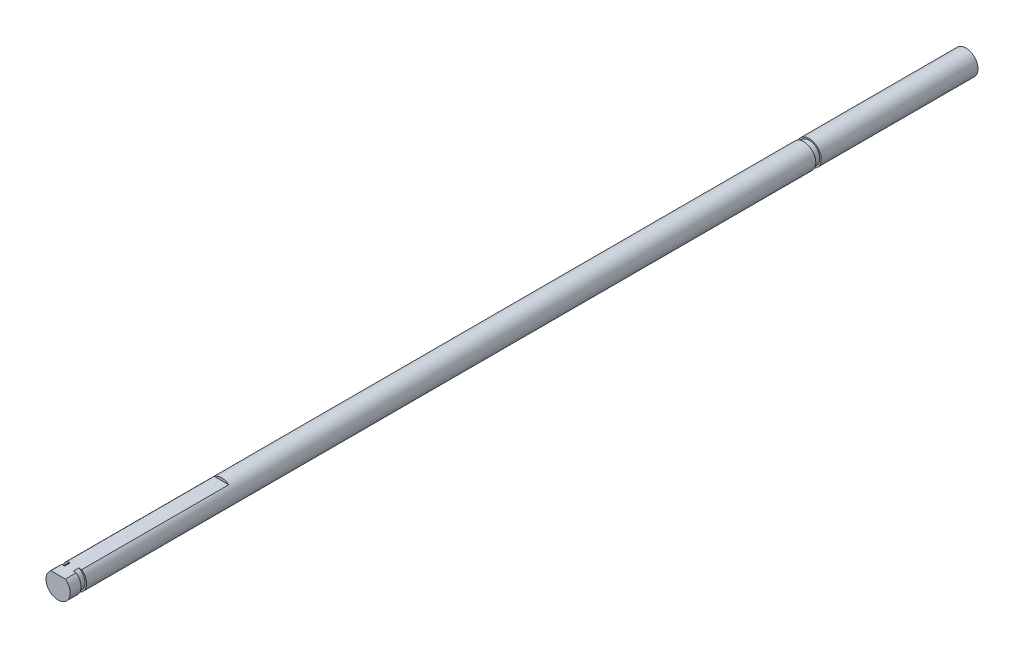
ISO-10303-21;
HEADER;
FILE_DESCRIPTION(('STEP AP214'),'2;1');
FILE_NAME('part.step','',(''),(''),'','','');
FILE_SCHEMA(('AUTOMOTIVE_DESIGN { 1 0 10303 214 1 1 1 1 }'));
ENDSEC;
DATA;
#1=APPLICATION_CONTEXT('core data for automotive mechanical design processes');
#2=APPLICATION_PROTOCOL_DEFINITION('international standard','automotive_design',2000,#1);
#3=PRODUCT_CONTEXT('',#1,'mechanical');
#4=PRODUCT('Part','Part','',(#3));
#5=PRODUCT_RELATED_PRODUCT_CATEGORY('part','',(#4));
#6=PRODUCT_DEFINITION_FORMATION('','',#4);
#7=PRODUCT_DEFINITION_CONTEXT('part definition',#1,'design');
#8=PRODUCT_DEFINITION('design','',#6,#7);
#9=PRODUCT_DEFINITION_SHAPE('','',#8);
#10=(LENGTH_UNIT() NAMED_UNIT(*) SI_UNIT(.MILLI.,.METRE.));
#11=(NAMED_UNIT(*) PLANE_ANGLE_UNIT() SI_UNIT($,.RADIAN.));
#12=(NAMED_UNIT(*) SI_UNIT($,.STERADIAN.) SOLID_ANGLE_UNIT());
#13=UNCERTAINTY_MEASURE_WITH_UNIT(LENGTH_MEASURE(1.E-05),#10,'distance_accuracy_value','');
#14=(GEOMETRIC_REPRESENTATION_CONTEXT(3) GLOBAL_UNCERTAINTY_ASSIGNED_CONTEXT((#13)) GLOBAL_UNIT_ASSIGNED_CONTEXT((#10,
#11,#12)) REPRESENTATION_CONTEXT('',''));
#15=CARTESIAN_POINT('',(0.,0.,0.));
#16=DIRECTION('',(0.,0.,1.));
#17=DIRECTION('',(1.,0.,0.));
#18=AXIS2_PLACEMENT_3D('',#15,#16,#17);
#19=CARTESIAN_POINT('',(0.,0.,75.));
#20=DIRECTION('',(0.,0.,-1.));
#21=DIRECTION('',(-1.,0.,0.));
#22=AXIS2_PLACEMENT_3D('',#19,#20,#21);
#23=CYLINDRICAL_SURFACE('',#22,2.);
#24=CARTESIAN_POINT('',(0.,0.,75.));
#25=DIRECTION('',(0.,0.,1.));
#26=DIRECTION('',(1.,0.,0.));
#27=AXIS2_PLACEMENT_3D('',#24,#25,#26);
#28=CIRCLE('',#27,2.);
#29=CARTESIAN_POINT('',(-1.2,1.6,75.));
#30=VERTEX_POINT('',#29);
#31=CARTESIAN_POINT('',(1.2,1.6,75.));
#32=VERTEX_POINT('',#31);
#33=EDGE_CURVE('E11',#30,#32,#28,.T.);
#34=ORIENTED_EDGE('',*,*,#33,.F.);
#35=DIRECTION('',(0.,0.,1.));
#36=VECTOR('',#35,1.);
#37=CARTESIAN_POINT('',(-1.2,1.6,48.));
#38=LINE('',#37,#36);
#39=CARTESIAN_POINT('',(-1.2,1.6,73.2));
#40=VERTEX_POINT('',#39);
#41=EDGE_CURVE('E102',#40,#30,#38,.T.);
#42=ORIENTED_EDGE('',*,*,#41,.F.);
#43=CARTESIAN_POINT('',(0.,0.,73.2));
#44=DIRECTION('',(0.,0.,-1.));
#45=DIRECTION('',(0.,1.,0.));
#46=AXIS2_PLACEMENT_3D('',#43,#44,#45);
#47=CIRCLE('',#46,2.);
#48=CARTESIAN_POINT('',(1.2,1.6,73.2));
#49=VERTEX_POINT('',#48);
#50=EDGE_CURVE('E133',#49,#40,#47,.T.);
#51=ORIENTED_EDGE('',*,*,#50,.F.);
#52=DIRECTION('',(0.,0.,1.));
#53=VECTOR('',#52,1.);
#54=CARTESIAN_POINT('',(1.2,1.6,48.));
#55=LINE('',#54,#53);
#56=EDGE_CURVE('E108',#49,#32,#55,.T.);
#57=ORIENTED_EDGE('',*,*,#56,.T.);
#58=EDGE_LOOP('',(#34,#42,#51,#57));
#59=FACE_BOUND('',#58,.T.);
#60=ADVANCED_FACE('F40',(#59),#23,.T.);
#61=CARTESIAN_POINT('',(0.,0.,75.));
#62=DIRECTION('',(0.,0.,1.));
#63=DIRECTION('',(1.,0.,0.));
#64=AXIS2_PLACEMENT_3D('',#61,#62,#63);
#65=PLANE('',#64);
#66=DIRECTION('',(1.,0.,0.));
#67=VECTOR('',#66,1.);
#68=CARTESIAN_POINT('',(1.2,1.6,75.));
#69=LINE('',#68,#67);
#70=EDGE_CURVE('E96',#30,#32,#69,.T.);
#71=ORIENTED_EDGE('',*,*,#70,.F.);
#72=ORIENTED_EDGE('',*,*,#33,.T.);
#73=EDGE_LOOP('',(#71,#72));
#74=FACE_BOUND('',#73,.T.);
#75=ADVANCED_FACE('F179',(#74),#65,.T.);
#76=CARTESIAN_POINT('',(0.,2.,73.2));
#77=DIRECTION('',(0.,0.,1.));
#78=DIRECTION('',(0.,-1.,0.));
#79=AXIS2_PLACEMENT_3D('',#76,#77,#78);
#80=PLANE('',#79);
#81=ORIENTED_EDGE('',*,*,#50,.T.);
#82=DIRECTION('',(1.,0.,0.));
#83=VECTOR('',#82,1.);
#84=CARTESIAN_POINT('',(0.,1.6,73.2));
#85=LINE('',#84,#83);
#86=CARTESIAN_POINT('',(-0.708872343937895,1.6,73.2));
#87=VERTEX_POINT('',#86);
#88=EDGE_CURVE('E120',#40,#87,#85,.T.);
#89=ORIENTED_EDGE('',*,*,#88,.T.);
#90=CARTESIAN_POINT('',(0.,0.,73.2));
#91=DIRECTION('',(0.,0.,-1.));
#92=DIRECTION('',(0.,1.,0.));
#93=AXIS2_PLACEMENT_3D('',#90,#91,#92);
#94=CIRCLE('',#93,1.75);
#95=CARTESIAN_POINT('',(0.708872343937895,1.6,73.2));
#96=VERTEX_POINT('',#95);
#97=EDGE_CURVE('E130',#96,#87,#94,.T.);
#98=ORIENTED_EDGE('',*,*,#97,.F.);
#99=EDGE_CURVE('E62',#96,#49,#85,.T.);
#100=ORIENTED_EDGE('',*,*,#99,.T.);
#101=EDGE_LOOP('',(#81,#89,#98,#100));
#102=FACE_BOUND('',#101,.T.);
#103=ADVANCED_FACE('F192',(#102),#80,.F.);
#104=CARTESIAN_POINT('',(0.,0.,-75.));
#105=DIRECTION('',(0.,0.,-1.));
#106=DIRECTION('',(0.,1.,0.));
#107=AXIS2_PLACEMENT_3D('',#104,#105,#106);
#108=CYLINDRICAL_SURFACE('',#107,1.75);
#109=ORIENTED_EDGE('',*,*,#97,.T.);
#110=DIRECTION('',(0.,0.,-1.));
#111=VECTOR('',#110,1.);
#112=CARTESIAN_POINT('',(-0.708872343937895,1.6,-75.));
#113=LINE('',#112,#111);
#114=CARTESIAN_POINT('',(-0.708872343937892,1.6,72.3));
#115=VERTEX_POINT('',#114);
#116=EDGE_CURVE('E116',#87,#115,#113,.T.);
#117=ORIENTED_EDGE('',*,*,#116,.T.);
#118=CARTESIAN_POINT('',(0.,0.,72.3));
#119=DIRECTION('',(0.,0.,-1.));
#120=DIRECTION('',(0.,1.,0.));
#121=AXIS2_PLACEMENT_3D('',#118,#119,#120);
#122=CIRCLE('',#121,1.75);
#123=CARTESIAN_POINT('',(0.708872343937892,1.6,72.3));
#124=VERTEX_POINT('',#123);
#125=EDGE_CURVE('E126',#124,#115,#122,.T.);
#126=ORIENTED_EDGE('',*,*,#125,.F.);
#127=DIRECTION('',(0.,0.,-1.));
#128=VECTOR('',#127,1.);
#129=CARTESIAN_POINT('',(0.708872343937895,1.6,-75.));
#130=LINE('',#129,#128);
#131=EDGE_CURVE('E123',#124,#96,#130,.F.);
#132=ORIENTED_EDGE('',*,*,#131,.T.);
#133=EDGE_LOOP('',(#109,#117,#126,#132));
#134=FACE_BOUND('',#133,.T.);
#135=ADVANCED_FACE('F175',(#134),#108,.T.);
#136=CARTESIAN_POINT('',(0.,1.75,72.3));
#137=DIRECTION('',(0.,0.,-1.));
#138=DIRECTION('',(0.,1.,0.));
#139=AXIS2_PLACEMENT_3D('',#136,#137,#138);
#140=PLANE('',#139);
#141=CARTESIAN_POINT('',(0.,0.,72.3));
#142=DIRECTION('',(0.,0.,-1.));
#143=DIRECTION('',(0.,1.,0.));
#144=AXIS2_PLACEMENT_3D('',#141,#142,#143);
#145=CIRCLE('',#144,2.);
#146=CARTESIAN_POINT('',(1.2,1.6,72.3));
#147=VERTEX_POINT('',#146);
#148=CARTESIAN_POINT('',(-1.2,1.6,72.3));
#149=VERTEX_POINT('',#148);
#150=EDGE_CURVE('E107',#147,#149,#145,.T.);
#151=ORIENTED_EDGE('',*,*,#150,.F.);
#152=DIRECTION('',(-1.,0.,0.));
#153=VECTOR('',#152,1.);
#154=CARTESIAN_POINT('',(0.,1.6,72.3));
#155=LINE('',#154,#153);
#156=EDGE_CURVE('E117',#147,#124,#155,.T.);
#157=ORIENTED_EDGE('',*,*,#156,.T.);
#158=ORIENTED_EDGE('',*,*,#125,.T.);
#159=EDGE_CURVE('E114',#115,#149,#155,.T.);
#160=ORIENTED_EDGE('',*,*,#159,.T.);
#161=EDGE_LOOP('',(#151,#157,#158,#160));
#162=FACE_BOUND('',#161,.T.);
#163=ADVANCED_FACE('F170',(#162),#140,.F.);
#164=ORIENTED_EDGE('',*,*,#150,.T.);
#165=CARTESIAN_POINT('',(-1.2,1.6,48.));
#166=VERTEX_POINT('',#165);
#167=EDGE_CURVE('E99',#166,#149,#38,.T.);
#168=ORIENTED_EDGE('',*,*,#167,.F.);
#169=CARTESIAN_POINT('',(0.,0.,48.));
#170=DIRECTION('',(0.,0.,1.));
#171=DIRECTION('',(1.,0.,0.));
#172=AXIS2_PLACEMENT_3D('',#169,#170,#171);
#173=CIRCLE('',#172,2.);
#174=CARTESIAN_POINT('',(1.2,1.6,48.));
#175=VERTEX_POINT('',#174);
#176=EDGE_CURVE('E91',#175,#166,#173,.T.);
#177=ORIENTED_EDGE('',*,*,#176,.F.);
#178=EDGE_CURVE('E101',#175,#147,#55,.T.);
#179=ORIENTED_EDGE('',*,*,#178,.T.);
#180=EDGE_LOOP('',(#164,#168,#177,#179));
#181=FACE_BOUND('',#180,.T.);
#182=CARTESIAN_POINT('',(0.,0.,-48.2));
#183=DIRECTION('',(0.,0.,-1.));
#184=DIRECTION('',(0.,1.,0.));
#185=AXIS2_PLACEMENT_3D('',#182,#183,#184);
#186=CIRCLE('',#185,2.);
#187=CARTESIAN_POINT('',(0.,2.,-48.2));
#188=VERTEX_POINT('',#187);
#189=EDGE_CURVE('E136',#188,#188,#186,.T.);
#190=ORIENTED_EDGE('',*,*,#189,.F.);
#191=EDGE_LOOP('',(#190));
#192=FACE_BOUND('',#191,.T.);
#193=ADVANCED_FACE('F42',(#181,#192),#23,.T.);
#194=CARTESIAN_POINT('',(0.,2.,-49.1));
#195=DIRECTION('',(0.,0.,-1.));
#196=DIRECTION('',(0.,1.,0.));
#197=AXIS2_PLACEMENT_3D('',#194,#195,#196);
#198=PLANE('',#197);
#199=CARTESIAN_POINT('',(0.,0.,-49.1));
#200=DIRECTION('',(0.,0.,-1.));
#201=DIRECTION('',(0.,1.,0.));
#202=AXIS2_PLACEMENT_3D('',#199,#200,#201);
#203=CIRCLE('',#202,2.);
#204=CARTESIAN_POINT('',(0.,2.,-49.1));
#205=VERTEX_POINT('',#204);
#206=EDGE_CURVE('E127',#205,#205,#203,.T.);
#207=ORIENTED_EDGE('',*,*,#206,.F.);
#208=EDGE_LOOP('',(#207));
#209=FACE_BOUND('',#208,.T.);
#210=CARTESIAN_POINT('',(0.,0.,-49.1));
#211=DIRECTION('',(0.,0.,-1.));
#212=DIRECTION('',(0.,1.,0.));
#213=AXIS2_PLACEMENT_3D('',#210,#211,#212);
#214=CIRCLE('',#213,1.75);
#215=CARTESIAN_POINT('',(0.,1.75,-49.1));
#216=VERTEX_POINT('',#215);
#217=EDGE_CURVE('E142',#216,#216,#214,.T.);
#218=ORIENTED_EDGE('',*,*,#217,.T.);
#219=EDGE_LOOP('',(#218));
#220=FACE_BOUND('',#219,.T.);
#221=ADVANCED_FACE('F151',(#209,#220),#198,.F.);
#222=CARTESIAN_POINT('',(0.,0.,-75.));
#223=DIRECTION('',(0.,0.,-1.));
#224=DIRECTION('',(0.,1.,0.));
#225=AXIS2_PLACEMENT_3D('',#222,#223,#224);
#226=CYLINDRICAL_SURFACE('',#225,1.75);
#227=ORIENTED_EDGE('',*,*,#217,.F.);
#228=EDGE_LOOP('',(#227));
#229=FACE_BOUND('',#228,.T.);
#230=CARTESIAN_POINT('',(0.,0.,-48.2));
#231=DIRECTION('',(0.,0.,-1.));
#232=DIRECTION('',(0.,1.,0.));
#233=AXIS2_PLACEMENT_3D('',#230,#231,#232);
#234=CIRCLE('',#233,1.75);
#235=CARTESIAN_POINT('',(0.,1.75,-48.2));
#236=VERTEX_POINT('',#235);
#237=EDGE_CURVE('E139',#236,#236,#234,.T.);
#238=ORIENTED_EDGE('',*,*,#237,.T.);
#239=EDGE_LOOP('',(#238));
#240=FACE_BOUND('',#239,.T.);
#241=ADVANCED_FACE('F154',(#229,#240),#226,.T.);
#242=CARTESIAN_POINT('',(0.,1.75,-48.2));
#243=DIRECTION('',(0.,0.,1.));
#244=DIRECTION('',(0.,-1.,0.));
#245=AXIS2_PLACEMENT_3D('',#242,#243,#244);
#246=PLANE('',#245);
#247=ORIENTED_EDGE('',*,*,#237,.F.);
#248=EDGE_LOOP('',(#247));
#249=FACE_BOUND('',#248,.T.);
#250=ORIENTED_EDGE('',*,*,#189,.T.);
#251=EDGE_LOOP('',(#250));
#252=FACE_BOUND('',#251,.T.);
#253=ADVANCED_FACE('F160',(#249,#252),#246,.F.);
#254=CARTESIAN_POINT('',(0.,0.,-75.));
#255=DIRECTION('',(0.,0.,1.));
#256=DIRECTION('',(1.,0.,0.));
#257=AXIS2_PLACEMENT_3D('',#254,#255,#256);
#258=PLANE('',#257);
#259=CARTESIAN_POINT('',(0.,0.,-75.));
#260=DIRECTION('',(0.,0.,1.));
#261=DIRECTION('',(1.,0.,0.));
#262=AXIS2_PLACEMENT_3D('',#259,#260,#261);
#263=CIRCLE('',#262,2.);
#264=CARTESIAN_POINT('',(2.,0.,-75.));
#265=VERTEX_POINT('',#264);
#266=EDGE_CURVE('E44',#265,#265,#263,.T.);
#267=ORIENTED_EDGE('',*,*,#266,.F.);
#268=EDGE_LOOP('',(#267));
#269=FACE_BOUND('',#268,.T.);
#270=ADVANCED_FACE('F166',(#269),#258,.F.);
#271=ORIENTED_EDGE('',*,*,#206,.T.);
#272=EDGE_LOOP('',(#271));
#273=FACE_BOUND('',#272,.T.);
#274=ORIENTED_EDGE('',*,*,#266,.T.);
#275=EDGE_LOOP('',(#274));
#276=FACE_BOUND('',#275,.T.);
#277=ADVANCED_FACE('F148',(#273,#276),#23,.T.);
#278=CARTESIAN_POINT('',(1.2,1.6,48.));
#279=DIRECTION('',(0.,-1.,0.));
#280=DIRECTION('',(0.,0.,-1.));
#281=AXIS2_PLACEMENT_3D('',#278,#279,#280);
#282=PLANE('',#281);
#283=ORIENTED_EDGE('',*,*,#131,.F.);
#284=ORIENTED_EDGE('',*,*,#156,.F.);
#285=ORIENTED_EDGE('',*,*,#178,.F.);
#286=DIRECTION('',(1.,0.,0.));
#287=VECTOR('',#286,1.);
#288=CARTESIAN_POINT('',(1.2,1.6,48.));
#289=LINE('',#288,#287);
#290=EDGE_CURVE('E54',#166,#175,#289,.T.);
#291=ORIENTED_EDGE('',*,*,#290,.F.);
#292=ORIENTED_EDGE('',*,*,#167,.T.);
#293=ORIENTED_EDGE('',*,*,#159,.F.);
#294=ORIENTED_EDGE('',*,*,#116,.F.);
#295=ORIENTED_EDGE('',*,*,#88,.F.);
#296=ORIENTED_EDGE('',*,*,#41,.T.);
#297=ORIENTED_EDGE('',*,*,#70,.T.);
#298=ORIENTED_EDGE('',*,*,#56,.F.);
#299=ORIENTED_EDGE('',*,*,#99,.F.);
#300=EDGE_LOOP('',(#283,#284,#285,#291,#292,#293,#294,#295,#296,#297,#298,#299));
#301=FACE_BOUND('',#300,.T.);
#302=ADVANCED_FACE('F98',(#301),#282,.F.);
#303=CARTESIAN_POINT('',(0.,0.,48.));
#304=DIRECTION('',(0.,0.,1.));
#305=DIRECTION('',(1.,0.,0.));
#306=AXIS2_PLACEMENT_3D('',#303,#304,#305);
#307=PLANE('',#306);
#308=ORIENTED_EDGE('',*,*,#176,.T.);
#309=ORIENTED_EDGE('',*,*,#290,.T.);
#310=EDGE_LOOP('',(#308,#309));
#311=FACE_BOUND('',#310,.T.);
#312=ADVANCED_FACE('F92',(#311),#307,.T.);
#313=CLOSED_SHELL('',(#60,#75,#103,#135,#163,#193,#221,#241,#253,#270,#277,#302,#312));
#314=MANIFOLD_SOLID_BREP('B2',#313);
#315=ADVANCED_BREP_SHAPE_REPRESENTATION('',(#18,#314),#14);
#316=SHAPE_DEFINITION_REPRESENTATION(#9,#315);
ENDSEC;
END-ISO-10303-21;
